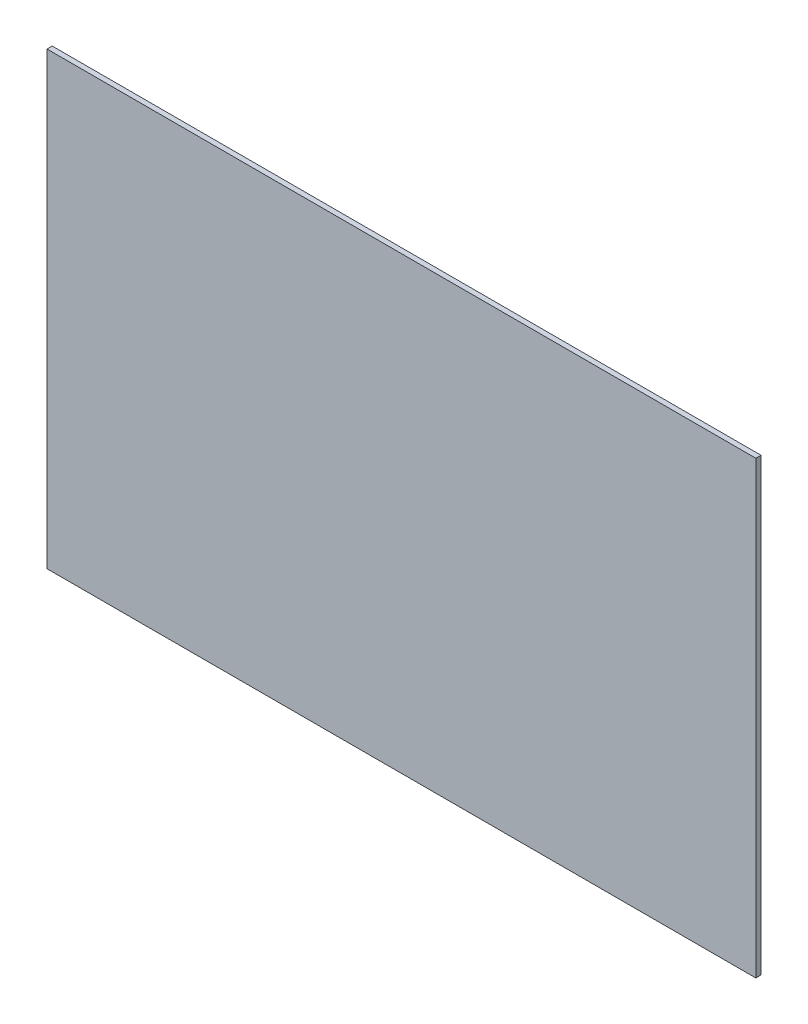
ISO-10303-21;
HEADER;
FILE_DESCRIPTION(('STEP AP214'),'2;1');
FILE_NAME('part.step','',(''),(''),'','','');
FILE_SCHEMA(('AUTOMOTIVE_DESIGN { 1 0 10303 214 1 1 1 1 }'));
ENDSEC;
DATA;
#1=APPLICATION_CONTEXT('core data for automotive mechanical design processes');
#2=APPLICATION_PROTOCOL_DEFINITION('international standard','automotive_design',2000,#1);
#3=PRODUCT_CONTEXT('',#1,'mechanical');
#4=PRODUCT('Part','Part','',(#3));
#5=PRODUCT_RELATED_PRODUCT_CATEGORY('part','',(#4));
#6=PRODUCT_DEFINITION_FORMATION('','',#4);
#7=PRODUCT_DEFINITION_CONTEXT('part definition',#1,'design');
#8=PRODUCT_DEFINITION('design','',#6,#7);
#9=PRODUCT_DEFINITION_SHAPE('','',#8);
#10=(LENGTH_UNIT() NAMED_UNIT(*) SI_UNIT(.MILLI.,.METRE.));
#11=(NAMED_UNIT(*) PLANE_ANGLE_UNIT() SI_UNIT($,.RADIAN.));
#12=(NAMED_UNIT(*) SI_UNIT($,.STERADIAN.) SOLID_ANGLE_UNIT());
#13=UNCERTAINTY_MEASURE_WITH_UNIT(LENGTH_MEASURE(1.E-05),#10,'distance_accuracy_value','');
#14=(GEOMETRIC_REPRESENTATION_CONTEXT(3) GLOBAL_UNCERTAINTY_ASSIGNED_CONTEXT((#13)) GLOBAL_UNIT_ASSIGNED_CONTEXT((#10,
#11,#12)) REPRESENTATION_CONTEXT('',''));
#15=CARTESIAN_POINT('',(0.,0.,0.));
#16=DIRECTION('',(0.,0.,1.));
#17=DIRECTION('',(1.,0.,0.));
#18=AXIS2_PLACEMENT_3D('',#15,#16,#17);
#19=CARTESIAN_POINT('',(274.,-174.,4.));
#20=DIRECTION('',(-1.,0.,0.));
#21=DIRECTION('',(0.,0.,1.));
#22=AXIS2_PLACEMENT_3D('',#19,#20,#21);
#23=PLANE('',#22);
#24=DIRECTION('',(0.,1.,0.));
#25=VECTOR('',#24,1.);
#26=CARTESIAN_POINT('',(274.,-174.,0.));
#27=LINE('',#26,#25);
#28=CARTESIAN_POINT('',(274.,-174.,0.));
#29=VERTEX_POINT('',#28);
#30=CARTESIAN_POINT('',(274.,174.,0.));
#31=VERTEX_POINT('',#30);
#32=EDGE_CURVE('E96',#29,#31,#27,.T.);
#33=ORIENTED_EDGE('',*,*,#32,.T.);
#34=DIRECTION('',(0.,0.,-1.));
#35=VECTOR('',#34,1.);
#36=CARTESIAN_POINT('',(274.,174.,4.));
#37=LINE('',#36,#35);
#38=CARTESIAN_POINT('',(274.,174.,4.));
#39=VERTEX_POINT('',#38);
#40=EDGE_CURVE('E11',#39,#31,#37,.T.);
#41=ORIENTED_EDGE('',*,*,#40,.F.);
#42=DIRECTION('',(0.,1.,0.));
#43=VECTOR('',#42,1.);
#44=CARTESIAN_POINT('',(274.,-174.,4.));
#45=LINE('',#44,#43);
#46=CARTESIAN_POINT('',(274.,-174.,4.));
#47=VERTEX_POINT('',#46);
#48=EDGE_CURVE('E84',#47,#39,#45,.T.);
#49=ORIENTED_EDGE('',*,*,#48,.F.);
#50=DIRECTION('',(0.,0.,-1.));
#51=VECTOR('',#50,1.);
#52=CARTESIAN_POINT('',(274.,-174.,4.));
#53=LINE('',#52,#51);
#54=EDGE_CURVE('E92',#47,#29,#53,.T.);
#55=ORIENTED_EDGE('',*,*,#54,.T.);
#56=EDGE_LOOP('',(#33,#41,#49,#55));
#57=FACE_BOUND('',#56,.T.);
#58=ADVANCED_FACE('F33',(#57),#23,.F.);
#59=CARTESIAN_POINT('',(-274.,174.,4.));
#60=DIRECTION('',(0.,-1.,0.));
#61=DIRECTION('',(0.,0.,-1.));
#62=AXIS2_PLACEMENT_3D('',#59,#60,#61);
#63=PLANE('',#62);
#64=DIRECTION('',(-1.,0.,0.));
#65=VECTOR('',#64,1.);
#66=CARTESIAN_POINT('',(-274.,174.,0.));
#67=LINE('',#66,#65);
#68=CARTESIAN_POINT('',(-274.,174.,0.));
#69=VERTEX_POINT('',#68);
#70=EDGE_CURVE('E88',#31,#69,#67,.T.);
#71=ORIENTED_EDGE('',*,*,#70,.T.);
#72=DIRECTION('',(0.,0.,-1.));
#73=VECTOR('',#72,1.);
#74=CARTESIAN_POINT('',(-274.,174.,4.));
#75=LINE('',#74,#73);
#76=CARTESIAN_POINT('',(-274.,174.,4.));
#77=VERTEX_POINT('',#76);
#78=EDGE_CURVE('E41',#77,#69,#75,.T.);
#79=ORIENTED_EDGE('',*,*,#78,.F.);
#80=DIRECTION('',(-1.,0.,0.));
#81=VECTOR('',#80,1.);
#82=CARTESIAN_POINT('',(-274.,174.,4.));
#83=LINE('',#82,#81);
#84=EDGE_CURVE('E79',#39,#77,#83,.T.);
#85=ORIENTED_EDGE('',*,*,#84,.F.);
#86=ORIENTED_EDGE('',*,*,#40,.T.);
#87=EDGE_LOOP('',(#71,#79,#85,#86));
#88=FACE_BOUND('',#87,.T.);
#89=ADVANCED_FACE('F87',(#88),#63,.F.);
#90=CARTESIAN_POINT('',(-274.,-174.,4.));
#91=DIRECTION('',(1.,0.,0.));
#92=DIRECTION('',(0.,0.,-1.));
#93=AXIS2_PLACEMENT_3D('',#90,#91,#92);
#94=PLANE('',#93);
#95=DIRECTION('',(0.,-1.,0.));
#96=VECTOR('',#95,1.);
#97=CARTESIAN_POINT('',(-274.,-174.,0.));
#98=LINE('',#97,#96);
#99=CARTESIAN_POINT('',(-274.,-174.,0.));
#100=VERTEX_POINT('',#99);
#101=EDGE_CURVE('E66',#69,#100,#98,.T.);
#102=ORIENTED_EDGE('',*,*,#101,.T.);
#103=DIRECTION('',(0.,0.,-1.));
#104=VECTOR('',#103,1.);
#105=CARTESIAN_POINT('',(-274.,-174.,4.));
#106=LINE('',#105,#104);
#107=CARTESIAN_POINT('',(-274.,-174.,4.));
#108=VERTEX_POINT('',#107);
#109=EDGE_CURVE('E89',#108,#100,#106,.T.);
#110=ORIENTED_EDGE('',*,*,#109,.F.);
#111=DIRECTION('',(0.,-1.,0.));
#112=VECTOR('',#111,1.);
#113=CARTESIAN_POINT('',(-274.,-174.,4.));
#114=LINE('',#113,#112);
#115=EDGE_CURVE('E82',#77,#108,#114,.T.);
#116=ORIENTED_EDGE('',*,*,#115,.F.);
#117=ORIENTED_EDGE('',*,*,#78,.T.);
#118=EDGE_LOOP('',(#102,#110,#116,#117));
#119=FACE_BOUND('',#118,.T.);
#120=ADVANCED_FACE('F90',(#119),#94,.F.);
#121=CARTESIAN_POINT('',(-274.,-174.,4.));
#122=DIRECTION('',(0.,1.,0.));
#123=DIRECTION('',(0.,0.,1.));
#124=AXIS2_PLACEMENT_3D('',#121,#122,#123);
#125=PLANE('',#124);
#126=DIRECTION('',(1.,0.,0.));
#127=VECTOR('',#126,1.);
#128=CARTESIAN_POINT('',(-274.,-174.,0.));
#129=LINE('',#128,#127);
#130=EDGE_CURVE('E72',#100,#29,#129,.T.);
#131=ORIENTED_EDGE('',*,*,#130,.T.);
#132=ORIENTED_EDGE('',*,*,#54,.F.);
#133=DIRECTION('',(1.,0.,0.));
#134=VECTOR('',#133,1.);
#135=CARTESIAN_POINT('',(-274.,-174.,4.));
#136=LINE('',#135,#134);
#137=EDGE_CURVE('E49',#108,#47,#136,.T.);
#138=ORIENTED_EDGE('',*,*,#137,.F.);
#139=ORIENTED_EDGE('',*,*,#109,.T.);
#140=EDGE_LOOP('',(#131,#132,#138,#139));
#141=FACE_BOUND('',#140,.T.);
#142=ADVANCED_FACE('F103',(#141),#125,.F.);
#143=CARTESIAN_POINT('',(0.,0.,4.));
#144=DIRECTION('',(0.,0.,-1.));
#145=DIRECTION('',(-1.,0.,0.));
#146=AXIS2_PLACEMENT_3D('',#143,#144,#145);
#147=PLANE('',#146);
#148=ORIENTED_EDGE('',*,*,#48,.T.);
#149=ORIENTED_EDGE('',*,*,#84,.T.);
#150=ORIENTED_EDGE('',*,*,#115,.T.);
#151=ORIENTED_EDGE('',*,*,#137,.T.);
#152=EDGE_LOOP('',(#148,#149,#150,#151));
#153=FACE_BOUND('',#152,.T.);
#154=ADVANCED_FACE('F80',(#153),#147,.F.);
#155=CARTESIAN_POINT('',(0.,0.,0.));
#156=DIRECTION('',(0.,0.,-1.));
#157=DIRECTION('',(-1.,0.,0.));
#158=AXIS2_PLACEMENT_3D('',#155,#156,#157);
#159=PLANE('',#158);
#160=ORIENTED_EDGE('',*,*,#32,.F.);
#161=ORIENTED_EDGE('',*,*,#130,.F.);
#162=ORIENTED_EDGE('',*,*,#101,.F.);
#163=ORIENTED_EDGE('',*,*,#70,.F.);
#164=EDGE_LOOP('',(#160,#161,#162,#163));
#165=FACE_BOUND('',#164,.T.);
#166=ADVANCED_FACE('F106',(#165),#159,.T.);
#167=CLOSED_SHELL('',(#58,#89,#120,#142,#154,#166));
#168=MANIFOLD_SOLID_BREP('B2',#167);
#169=ADVANCED_BREP_SHAPE_REPRESENTATION('',(#18,#168),#14);
#170=SHAPE_DEFINITION_REPRESENTATION(#9,#169);
ENDSEC;
END-ISO-10303-21;
